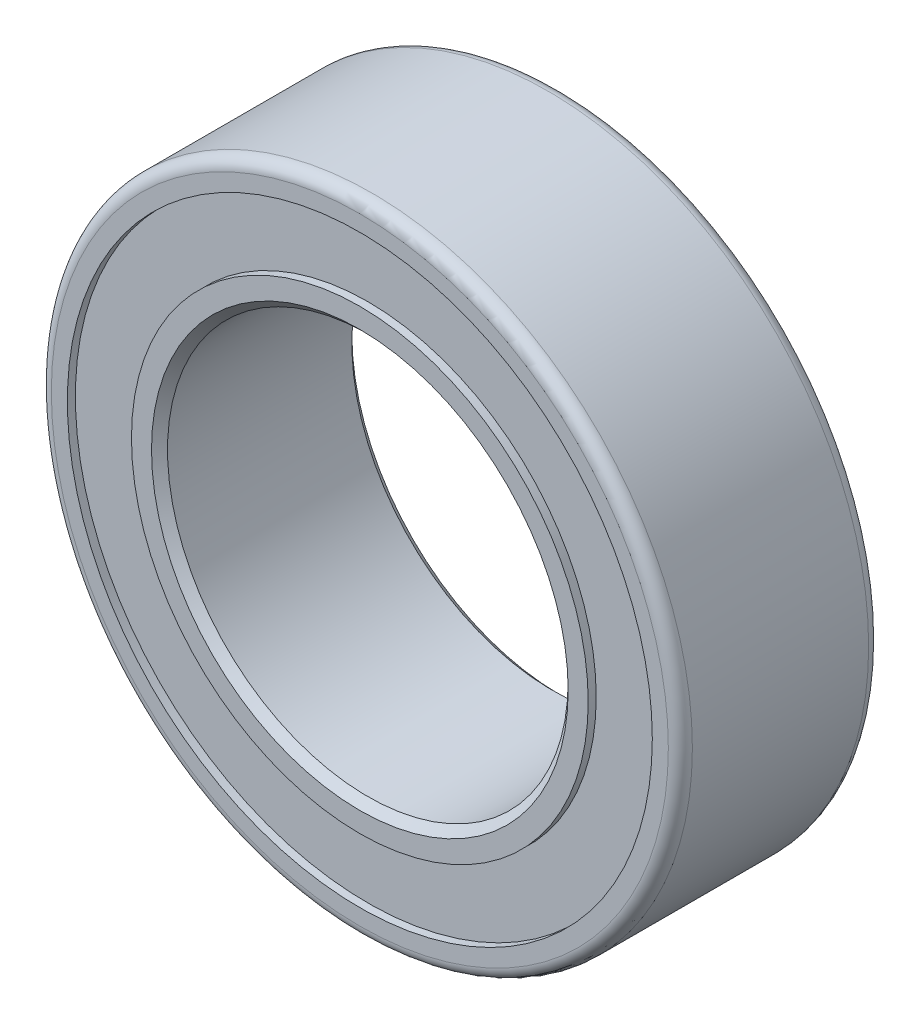
ISO-10303-21;
HEADER;
FILE_DESCRIPTION(('STEP AP214'),'2;1');
FILE_NAME('part.step','',(''),(''),'','','');
FILE_SCHEMA(('AUTOMOTIVE_DESIGN { 1 0 10303 214 1 1 1 1 }'));
ENDSEC;
DATA;
#1=APPLICATION_CONTEXT('core data for automotive mechanical design processes');
#2=APPLICATION_PROTOCOL_DEFINITION('international standard','automotive_design',2000,#1);
#3=PRODUCT_CONTEXT('',#1,'mechanical');
#4=PRODUCT('Part','Part','',(#3));
#5=PRODUCT_RELATED_PRODUCT_CATEGORY('part','',(#4));
#6=PRODUCT_DEFINITION_FORMATION('','',#4);
#7=PRODUCT_DEFINITION_CONTEXT('part definition',#1,'design');
#8=PRODUCT_DEFINITION('design','',#6,#7);
#9=PRODUCT_DEFINITION_SHAPE('','',#8);
#10=(LENGTH_UNIT() NAMED_UNIT(*) SI_UNIT(.MILLI.,.METRE.));
#11=(NAMED_UNIT(*) PLANE_ANGLE_UNIT() SI_UNIT($,.RADIAN.));
#12=(NAMED_UNIT(*) SI_UNIT($,.STERADIAN.) SOLID_ANGLE_UNIT());
#13=UNCERTAINTY_MEASURE_WITH_UNIT(LENGTH_MEASURE(1.E-05),#10,'distance_accuracy_value','');
#14=(GEOMETRIC_REPRESENTATION_CONTEXT(3) GLOBAL_UNCERTAINTY_ASSIGNED_CONTEXT((#13)) GLOBAL_UNIT_ASSIGNED_CONTEXT((#10,
#11,#12)) REPRESENTATION_CONTEXT('',''));
#15=CARTESIAN_POINT('',(0.,0.,0.));
#16=DIRECTION('',(0.,0.,1.));
#17=DIRECTION('',(1.,0.,0.));
#18=AXIS2_PLACEMENT_3D('',#15,#16,#17);
#19=CARTESIAN_POINT('',(0.,0.,-1.25));
#20=DIRECTION('',(0.,0.,1.));
#21=DIRECTION('',(1.,0.,0.));
#22=AXIS2_PLACEMENT_3D('',#19,#20,#21);
#23=PLANE('',#22);
#24=CARTESIAN_POINT('',(0.,0.,-1.25));
#25=DIRECTION('',(0.,0.,1.));
#26=DIRECTION('',(1.,0.,0.));
#27=AXIS2_PLACEMENT_3D('',#24,#25,#26);
#28=CIRCLE('',#27,2.6);
#29=CARTESIAN_POINT('',(2.6,0.,-1.25));
#30=VERTEX_POINT('',#29);
#31=EDGE_CURVE('E28',#30,#30,#28,.T.);
#32=ORIENTED_EDGE('',*,*,#31,.T.);
#33=EDGE_LOOP('',(#32));
#34=FACE_BOUND('',#33,.T.);
#35=CARTESIAN_POINT('',(0.,0.,-1.25));
#36=DIRECTION('',(0.,0.,1.));
#37=DIRECTION('',(1.,0.,0.));
#38=AXIS2_PLACEMENT_3D('',#35,#36,#37);
#39=CIRCLE('',#38,2.85);
#40=CARTESIAN_POINT('',(2.85,0.,-1.25));
#41=VERTEX_POINT('',#40);
#42=EDGE_CURVE('E69',#41,#41,#39,.T.);
#43=ORIENTED_EDGE('',*,*,#42,.F.);
#44=EDGE_LOOP('',(#43));
#45=FACE_BOUND('',#44,.T.);
#46=ADVANCED_FACE('F15',(#34,#45),#23,.F.);
#47=CARTESIAN_POINT('',(0.,0.,1.25));
#48=DIRECTION('',(0.,0.,1.));
#49=DIRECTION('',(1.,0.,0.));
#50=AXIS2_PLACEMENT_3D('',#47,#48,#49);
#51=PLANE('',#50);
#52=CARTESIAN_POINT('',(0.,0.,1.25));
#53=DIRECTION('',(0.,0.,1.));
#54=DIRECTION('',(1.,0.,0.));
#55=AXIS2_PLACEMENT_3D('',#52,#53,#54);
#56=CIRCLE('',#55,2.6);
#57=CARTESIAN_POINT('',(2.6,0.,1.25));
#58=VERTEX_POINT('',#57);
#59=EDGE_CURVE('E10',#58,#58,#56,.F.);
#60=ORIENTED_EDGE('',*,*,#59,.T.);
#61=EDGE_LOOP('',(#60));
#62=FACE_BOUND('',#61,.T.);
#63=CARTESIAN_POINT('',(0.,0.,1.25));
#64=DIRECTION('',(0.,0.,1.));
#65=DIRECTION('',(1.,0.,0.));
#66=AXIS2_PLACEMENT_3D('',#63,#64,#65);
#67=CIRCLE('',#66,2.85);
#68=CARTESIAN_POINT('',(2.85,0.,1.25));
#69=VERTEX_POINT('',#68);
#70=EDGE_CURVE('E53',#69,#69,#67,.T.);
#71=ORIENTED_EDGE('',*,*,#70,.T.);
#72=EDGE_LOOP('',(#71));
#73=FACE_BOUND('',#72,.T.);
#74=ADVANCED_FACE('F85',(#62,#73),#51,.T.);
#75=CARTESIAN_POINT('',(0.,0.,1.25));
#76=DIRECTION('',(0.,0.,1.));
#77=DIRECTION('',(1.,0.,0.));
#78=AXIS2_PLACEMENT_3D('',#75,#76,#77);
#79=CIRCLE('',#78,3.65);
#80=CARTESIAN_POINT('',(3.65,0.,1.25));
#81=VERTEX_POINT('',#80);
#82=EDGE_CURVE('E48',#81,#81,#79,.T.);
#83=ORIENTED_EDGE('',*,*,#82,.F.);
#84=EDGE_LOOP('',(#83));
#85=FACE_BOUND('',#84,.T.);
#86=CARTESIAN_POINT('',(0.,0.,1.25));
#87=DIRECTION('',(0.,0.,1.));
#88=DIRECTION('',(1.,0.,0.));
#89=AXIS2_PLACEMENT_3D('',#86,#87,#88);
#90=CIRCLE('',#89,3.85);
#91=CARTESIAN_POINT('',(3.85,0.,1.25));
#92=VERTEX_POINT('',#91);
#93=EDGE_CURVE('E34',#92,#92,#90,.T.);
#94=ORIENTED_EDGE('',*,*,#93,.T.);
#95=EDGE_LOOP('',(#94));
#96=FACE_BOUND('',#95,.T.);
#97=ADVANCED_FACE('F93',(#85,#96),#51,.T.);
#98=CARTESIAN_POINT('',(0.,0.,-1.25));
#99=DIRECTION('',(0.,0.,1.));
#100=DIRECTION('',(1.,0.,0.));
#101=AXIS2_PLACEMENT_3D('',#98,#99,#100);
#102=CIRCLE('',#101,3.65);
#103=CARTESIAN_POINT('',(3.65,0.,-1.25));
#104=VERTEX_POINT('',#103);
#105=EDGE_CURVE('E58',#104,#104,#102,.T.);
#106=ORIENTED_EDGE('',*,*,#105,.T.);
#107=EDGE_LOOP('',(#106));
#108=FACE_BOUND('',#107,.T.);
#109=CARTESIAN_POINT('',(0.,0.,-1.25));
#110=DIRECTION('',(0.,0.,1.));
#111=DIRECTION('',(1.,0.,0.));
#112=AXIS2_PLACEMENT_3D('',#109,#110,#111);
#113=CIRCLE('',#112,3.85);
#114=CARTESIAN_POINT('',(3.85,0.,-1.25));
#115=VERTEX_POINT('',#114);
#116=EDGE_CURVE('E36',#115,#115,#113,.F.);
#117=ORIENTED_EDGE('',*,*,#116,.T.);
#118=EDGE_LOOP('',(#117));
#119=FACE_BOUND('',#118,.T.);
#120=ADVANCED_FACE('F83',(#108,#119),#23,.F.);
#121=CARTESIAN_POINT('',(0.,0.,1.25));
#122=DIRECTION('',(0.,0.,-1.));
#123=DIRECTION('',(-1.,0.,0.));
#124=AXIS2_PLACEMENT_3D('',#121,#122,#123);
#125=CYLINDRICAL_SURFACE('',#124,4.);
#126=CARTESIAN_POINT('',(0.,0.,-1.1));
#127=DIRECTION('',(0.,0.,1.));
#128=DIRECTION('',(1.,0.,0.));
#129=AXIS2_PLACEMENT_3D('',#126,#127,#128);
#130=CIRCLE('',#129,4.);
#131=CARTESIAN_POINT('',(4.,0.,-1.1));
#132=VERTEX_POINT('',#131);
#133=EDGE_CURVE('E41',#132,#132,#130,.T.);
#134=ORIENTED_EDGE('',*,*,#133,.T.);
#135=EDGE_LOOP('',(#134));
#136=FACE_BOUND('',#135,.T.);
#137=CARTESIAN_POINT('',(0.,0.,1.1));
#138=DIRECTION('',(0.,0.,1.));
#139=DIRECTION('',(1.,0.,0.));
#140=AXIS2_PLACEMENT_3D('',#137,#138,#139);
#141=CIRCLE('',#140,4.);
#142=CARTESIAN_POINT('',(4.,0.,1.1));
#143=VERTEX_POINT('',#142);
#144=EDGE_CURVE('E42',#143,#143,#141,.F.);
#145=ORIENTED_EDGE('',*,*,#144,.T.);
#146=EDGE_LOOP('',(#145));
#147=FACE_BOUND('',#146,.T.);
#148=ADVANCED_FACE('F92',(#136,#147),#125,.T.);
#149=CARTESIAN_POINT('',(0.,0.,1.25));
#150=DIRECTION('',(0.,0.,-1.));
#151=DIRECTION('',(-1.,0.,0.));
#152=AXIS2_PLACEMENT_3D('',#149,#150,#151);
#153=CYLINDRICAL_SURFACE('',#152,2.5);
#154=CARTESIAN_POINT('',(0.,0.,-1.15));
#155=DIRECTION('',(0.,0.,1.));
#156=DIRECTION('',(1.,0.,0.));
#157=AXIS2_PLACEMENT_3D('',#154,#155,#156);
#158=CIRCLE('',#157,2.5);
#159=CARTESIAN_POINT('',(2.5,0.,-1.15));
#160=VERTEX_POINT('',#159);
#161=EDGE_CURVE('E22',#160,#160,#158,.F.);
#162=ORIENTED_EDGE('',*,*,#161,.T.);
#163=EDGE_LOOP('',(#162));
#164=FACE_BOUND('',#163,.T.);
#165=CARTESIAN_POINT('',(0.,0.,1.15));
#166=DIRECTION('',(0.,0.,1.));
#167=DIRECTION('',(1.,0.,0.));
#168=AXIS2_PLACEMENT_3D('',#165,#166,#167);
#169=CIRCLE('',#168,2.5);
#170=CARTESIAN_POINT('',(2.5,0.,1.15));
#171=VERTEX_POINT('',#170);
#172=EDGE_CURVE('E27',#171,#171,#169,.T.);
#173=ORIENTED_EDGE('',*,*,#172,.T.);
#174=EDGE_LOOP('',(#173));
#175=FACE_BOUND('',#174,.T.);
#176=ADVANCED_FACE('F105',(#164,#175),#153,.F.);
#177=CARTESIAN_POINT('',(0.,0.,-1.1));
#178=DIRECTION('',(0.,0.,1.));
#179=DIRECTION('',(1.,0.,0.));
#180=AXIS2_PLACEMENT_3D('',#177,#178,#179);
#181=TOROIDAL_SURFACE('',#180,3.85,0.15);
#182=ORIENTED_EDGE('',*,*,#116,.F.);
#183=EDGE_LOOP('',(#182));
#184=FACE_BOUND('',#183,.T.);
#185=ORIENTED_EDGE('',*,*,#133,.F.);
#186=EDGE_LOOP('',(#185));
#187=FACE_BOUND('',#186,.T.);
#188=ADVANCED_FACE('F108',(#184,#187),#181,.T.);
#189=CARTESIAN_POINT('',(0.,0.,1.1));
#190=DIRECTION('',(0.,0.,1.));
#191=DIRECTION('',(1.,0.,0.));
#192=AXIS2_PLACEMENT_3D('',#189,#190,#191);
#193=TOROIDAL_SURFACE('',#192,3.85,0.15);
#194=ORIENTED_EDGE('',*,*,#144,.F.);
#195=EDGE_LOOP('',(#194));
#196=FACE_BOUND('',#195,.T.);
#197=ORIENTED_EDGE('',*,*,#93,.F.);
#198=EDGE_LOOP('',(#197));
#199=FACE_BOUND('',#198,.T.);
#200=ADVANCED_FACE('F115',(#196,#199),#193,.T.);
#201=CARTESIAN_POINT('',(0.,0.,-1.25));
#202=DIRECTION('',(0.,0.,-1.));
#203=DIRECTION('',(-1.,0.,0.));
#204=AXIS2_PLACEMENT_3D('',#201,#202,#203);
#205=CONICAL_SURFACE('',#204,2.6,0.785398163397442);
#206=ORIENTED_EDGE('',*,*,#161,.F.);
#207=EDGE_LOOP('',(#206));
#208=FACE_BOUND('',#207,.T.);
#209=ORIENTED_EDGE('',*,*,#31,.F.);
#210=EDGE_LOOP('',(#209));
#211=FACE_BOUND('',#210,.T.);
#212=ADVANCED_FACE('F120',(#208,#211),#205,.F.);
#213=CARTESIAN_POINT('',(0.,0.,1.15));
#214=DIRECTION('',(0.,0.,1.));
#215=DIRECTION('',(1.,0.,0.));
#216=AXIS2_PLACEMENT_3D('',#213,#214,#215);
#217=CONICAL_SURFACE('',#216,2.5,0.78539816339745);
#218=ORIENTED_EDGE('',*,*,#59,.F.);
#219=EDGE_LOOP('',(#218));
#220=FACE_BOUND('',#219,.T.);
#221=ORIENTED_EDGE('',*,*,#172,.F.);
#222=EDGE_LOOP('',(#221));
#223=FACE_BOUND('',#222,.T.);
#224=ADVANCED_FACE('F17',(#220,#223),#217,.F.);
#225=CARTESIAN_POINT('',(0.,0.,1.15));
#226=DIRECTION('',(0.,0.,1.));
#227=DIRECTION('',(1.,0.,0.));
#228=AXIS2_PLACEMENT_3D('',#225,#226,#227);
#229=CYLINDRICAL_SURFACE('',#228,3.65);
#230=CARTESIAN_POINT('',(0.,0.,1.15));
#231=DIRECTION('',(0.,0.,1.));
#232=DIRECTION('',(1.,0.,0.));
#233=AXIS2_PLACEMENT_3D('',#230,#231,#232);
#234=CIRCLE('',#233,3.65);
#235=CARTESIAN_POINT('',(3.65,0.,1.15));
#236=VERTEX_POINT('',#235);
#237=EDGE_CURVE('E50',#236,#236,#234,.T.);
#238=ORIENTED_EDGE('',*,*,#237,.F.);
#239=EDGE_LOOP('',(#238));
#240=FACE_BOUND('',#239,.T.);
#241=ORIENTED_EDGE('',*,*,#82,.T.);
#242=EDGE_LOOP('',(#241));
#243=FACE_BOUND('',#242,.T.);
#244=ADVANCED_FACE('F132',(#240,#243),#229,.F.);
#245=CARTESIAN_POINT('',(0.,0.,1.15));
#246=DIRECTION('',(0.,0.,1.));
#247=DIRECTION('',(1.,0.,0.));
#248=AXIS2_PLACEMENT_3D('',#245,#246,#247);
#249=PLANE('',#248);
#250=CARTESIAN_POINT('',(0.,0.,1.15));
#251=DIRECTION('',(0.,0.,1.));
#252=DIRECTION('',(1.,0.,0.));
#253=AXIS2_PLACEMENT_3D('',#250,#251,#252);
#254=CIRCLE('',#253,2.85);
#255=CARTESIAN_POINT('',(2.85,0.,1.15));
#256=VERTEX_POINT('',#255);
#257=EDGE_CURVE('E51',#256,#256,#254,.T.);
#258=ORIENTED_EDGE('',*,*,#257,.F.);
#259=EDGE_LOOP('',(#258));
#260=FACE_BOUND('',#259,.T.);
#261=ORIENTED_EDGE('',*,*,#237,.T.);
#262=EDGE_LOOP('',(#261));
#263=FACE_BOUND('',#262,.T.);
#264=ADVANCED_FACE('F142',(#260,#263),#249,.T.);
#265=CARTESIAN_POINT('',(0.,0.,1.15));
#266=DIRECTION('',(0.,0.,1.));
#267=DIRECTION('',(1.,0.,0.));
#268=AXIS2_PLACEMENT_3D('',#265,#266,#267);
#269=CYLINDRICAL_SURFACE('',#268,2.85);
#270=ORIENTED_EDGE('',*,*,#257,.T.);
#271=EDGE_LOOP('',(#270));
#272=FACE_BOUND('',#271,.T.);
#273=ORIENTED_EDGE('',*,*,#70,.F.);
#274=EDGE_LOOP('',(#273));
#275=FACE_BOUND('',#274,.T.);
#276=ADVANCED_FACE('F156',(#272,#275),#269,.T.);
#277=CARTESIAN_POINT('',(0.,0.,-1.15));
#278=DIRECTION('',(0.,0.,-1.));
#279=DIRECTION('',(1.,0.,0.));
#280=AXIS2_PLACEMENT_3D('',#277,#278,#279);
#281=PLANE('',#280);
#282=CARTESIAN_POINT('',(0.,0.,-1.15));
#283=DIRECTION('',(0.,0.,1.));
#284=DIRECTION('',(1.,0.,0.));
#285=AXIS2_PLACEMENT_3D('',#282,#283,#284);
#286=CIRCLE('',#285,3.65);
#287=CARTESIAN_POINT('',(3.65,0.,-1.15));
#288=VERTEX_POINT('',#287);
#289=EDGE_CURVE('E60',#288,#288,#286,.T.);
#290=ORIENTED_EDGE('',*,*,#289,.F.);
#291=EDGE_LOOP('',(#290));
#292=FACE_BOUND('',#291,.T.);
#293=CARTESIAN_POINT('',(0.,0.,-1.15));
#294=DIRECTION('',(0.,0.,1.));
#295=DIRECTION('',(1.,0.,0.));
#296=AXIS2_PLACEMENT_3D('',#293,#294,#295);
#297=CIRCLE('',#296,2.85);
#298=CARTESIAN_POINT('',(2.85,0.,-1.15));
#299=VERTEX_POINT('',#298);
#300=EDGE_CURVE('E64',#299,#299,#297,.T.);
#301=ORIENTED_EDGE('',*,*,#300,.T.);
#302=EDGE_LOOP('',(#301));
#303=FACE_BOUND('',#302,.T.);
#304=ADVANCED_FACE('F71',(#292,#303),#281,.T.);
#305=CARTESIAN_POINT('',(0.,0.,-1.15));
#306=DIRECTION('',(0.,0.,-1.));
#307=DIRECTION('',(-1.,0.,0.));
#308=AXIS2_PLACEMENT_3D('',#305,#306,#307);
#309=CYLINDRICAL_SURFACE('',#308,3.65);
#310=ORIENTED_EDGE('',*,*,#289,.T.);
#311=EDGE_LOOP('',(#310));
#312=FACE_BOUND('',#311,.T.);
#313=ORIENTED_EDGE('',*,*,#105,.F.);
#314=EDGE_LOOP('',(#313));
#315=FACE_BOUND('',#314,.T.);
#316=ADVANCED_FACE('F80',(#312,#315),#309,.F.);
#317=CARTESIAN_POINT('',(0.,0.,-1.15));
#318=DIRECTION('',(0.,0.,-1.));
#319=DIRECTION('',(-1.,0.,0.));
#320=AXIS2_PLACEMENT_3D('',#317,#318,#319);
#321=CYLINDRICAL_SURFACE('',#320,2.85);
#322=ORIENTED_EDGE('',*,*,#300,.F.);
#323=EDGE_LOOP('',(#322));
#324=FACE_BOUND('',#323,.T.);
#325=ORIENTED_EDGE('',*,*,#42,.T.);
#326=EDGE_LOOP('',(#325));
#327=FACE_BOUND('',#326,.T.);
#328=ADVANCED_FACE('F72',(#324,#327),#321,.T.);
#329=CLOSED_SHELL('',(#46,#74,#97,#120,#148,#176,#188,#200,#212,#224,#244,#264,#276,#304,#316,#328));
#330=MANIFOLD_SOLID_BREP('B1',#329);
#331=ADVANCED_BREP_SHAPE_REPRESENTATION('',(#18,#330),#14);
#332=SHAPE_DEFINITION_REPRESENTATION(#9,#331);
ENDSEC;
END-ISO-10303-21;
